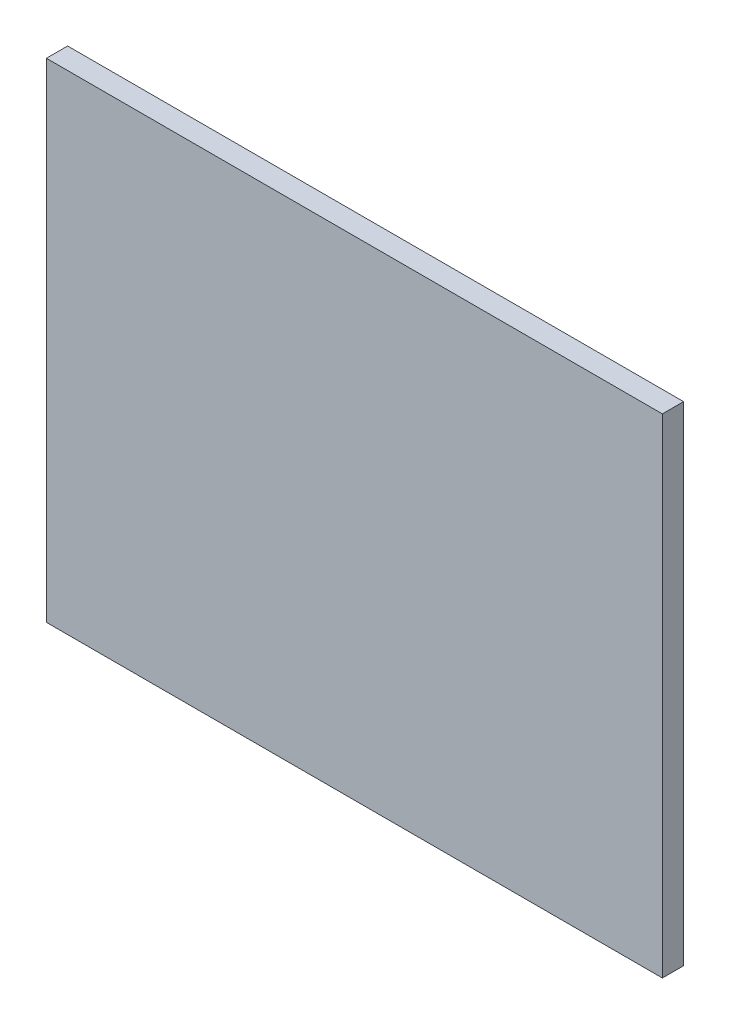
ISO-10303-21;
HEADER;
FILE_DESCRIPTION(('STEP AP214'),'2;1');
FILE_NAME('part.step','',(''),(''),'','','');
FILE_SCHEMA(('AUTOMOTIVE_DESIGN { 1 0 10303 214 1 1 1 1 }'));
ENDSEC;
DATA;
#1=APPLICATION_CONTEXT('core data for automotive mechanical design processes');
#2=APPLICATION_PROTOCOL_DEFINITION('international standard','automotive_design',2000,#1);
#3=PRODUCT_CONTEXT('',#1,'mechanical');
#4=PRODUCT('Part','Part','',(#3));
#5=PRODUCT_RELATED_PRODUCT_CATEGORY('part','',(#4));
#6=PRODUCT_DEFINITION_FORMATION('','',#4);
#7=PRODUCT_DEFINITION_CONTEXT('part definition',#1,'design');
#8=PRODUCT_DEFINITION('design','',#6,#7);
#9=PRODUCT_DEFINITION_SHAPE('','',#8);
#10=(LENGTH_UNIT() NAMED_UNIT(*) SI_UNIT(.MILLI.,.METRE.));
#11=(NAMED_UNIT(*) PLANE_ANGLE_UNIT() SI_UNIT($,.RADIAN.));
#12=(NAMED_UNIT(*) SI_UNIT($,.STERADIAN.) SOLID_ANGLE_UNIT());
#13=UNCERTAINTY_MEASURE_WITH_UNIT(LENGTH_MEASURE(1.E-05),#10,'distance_accuracy_value','');
#14=(GEOMETRIC_REPRESENTATION_CONTEXT(3) GLOBAL_UNCERTAINTY_ASSIGNED_CONTEXT((#13)) GLOBAL_UNIT_ASSIGNED_CONTEXT((#10,
#11,#12)) REPRESENTATION_CONTEXT('',''));
#15=CARTESIAN_POINT('',(0.,0.,0.));
#16=DIRECTION('',(0.,0.,1.));
#17=DIRECTION('',(1.,0.,0.));
#18=AXIS2_PLACEMENT_3D('',#15,#16,#17);
#19=CARTESIAN_POINT('',(0.,0.,10.));
#20=DIRECTION('',(1.,0.,0.));
#21=DIRECTION('',(0.,0.,-1.));
#22=AXIS2_PLACEMENT_3D('',#19,#20,#21);
#23=PLANE('',#22);
#24=DIRECTION('',(0.,-1.,0.));
#25=VECTOR('',#24,1.);
#26=CARTESIAN_POINT('',(0.,0.,0.));
#27=LINE('',#26,#25);
#28=CARTESIAN_POINT('',(0.,230.,0.));
#29=VERTEX_POINT('',#28);
#30=CARTESIAN_POINT('',(0.,0.,0.));
#31=VERTEX_POINT('',#30);
#32=EDGE_CURVE('E120',#29,#31,#27,.T.);
#33=ORIENTED_EDGE('',*,*,#32,.T.);
#34=DIRECTION('',(0.,0.,-1.));
#35=VECTOR('',#34,1.);
#36=CARTESIAN_POINT('',(0.,0.,10.));
#37=LINE('',#36,#35);
#38=CARTESIAN_POINT('',(0.,0.,10.));
#39=VERTEX_POINT('',#38);
#40=EDGE_CURVE('E11',#39,#31,#37,.T.);
#41=ORIENTED_EDGE('',*,*,#40,.F.);
#42=DIRECTION('',(0.,-1.,0.));
#43=VECTOR('',#42,1.);
#44=CARTESIAN_POINT('',(0.,0.,10.));
#45=LINE('',#44,#43);
#46=CARTESIAN_POINT('',(0.,230.,10.));
#47=VERTEX_POINT('',#46);
#48=EDGE_CURVE('E129',#47,#39,#45,.T.);
#49=ORIENTED_EDGE('',*,*,#48,.F.);
#50=DIRECTION('',(0.,0.,-1.));
#51=VECTOR('',#50,1.);
#52=CARTESIAN_POINT('',(0.,230.,10.));
#53=LINE('',#52,#51);
#54=EDGE_CURVE('E138',#47,#29,#53,.T.);
#55=ORIENTED_EDGE('',*,*,#54,.T.);
#56=EDGE_LOOP('',(#33,#41,#49,#55));
#57=FACE_BOUND('',#56,.T.);
#58=ADVANCED_FACE('F36',(#57),#23,.F.);
#59=CARTESIAN_POINT('',(0.,0.,10.));
#60=DIRECTION('',(0.,1.,0.));
#61=DIRECTION('',(0.,0.,1.));
#62=AXIS2_PLACEMENT_3D('',#59,#60,#61);
#63=PLANE('',#62);
#64=DIRECTION('',(1.,0.,0.));
#65=VECTOR('',#64,1.);
#66=CARTESIAN_POINT('',(0.,0.,0.));
#67=LINE('',#66,#65);
#68=CARTESIAN_POINT('',(290.,0.,0.));
#69=VERTEX_POINT('',#68);
#70=EDGE_CURVE('E123',#31,#69,#67,.T.);
#71=ORIENTED_EDGE('',*,*,#70,.T.);
#72=DIRECTION('',(0.,0.,-1.));
#73=VECTOR('',#72,1.);
#74=CARTESIAN_POINT('',(290.,0.,10.));
#75=LINE('',#74,#73);
#76=CARTESIAN_POINT('',(290.,0.,10.));
#77=VERTEX_POINT('',#76);
#78=EDGE_CURVE('E43',#77,#69,#75,.T.);
#79=ORIENTED_EDGE('',*,*,#78,.F.);
#80=DIRECTION('',(1.,0.,0.));
#81=VECTOR('',#80,1.);
#82=CARTESIAN_POINT('',(0.,0.,10.));
#83=LINE('',#82,#81);
#84=EDGE_CURVE('E132',#39,#77,#83,.T.);
#85=ORIENTED_EDGE('',*,*,#84,.F.);
#86=ORIENTED_EDGE('',*,*,#40,.T.);
#87=EDGE_LOOP('',(#71,#79,#85,#86));
#88=FACE_BOUND('',#87,.T.);
#89=ADVANCED_FACE('F169',(#88),#63,.F.);
#90=CARTESIAN_POINT('',(290.,0.,10.));
#91=DIRECTION('',(-1.,0.,0.));
#92=DIRECTION('',(0.,0.,1.));
#93=AXIS2_PLACEMENT_3D('',#90,#91,#92);
#94=PLANE('',#93);
#95=DIRECTION('',(0.,1.,0.));
#96=VECTOR('',#95,1.);
#97=CARTESIAN_POINT('',(290.,0.,0.));
#98=LINE('',#97,#96);
#99=CARTESIAN_POINT('',(290.,230.,0.));
#100=VERTEX_POINT('',#99);
#101=EDGE_CURVE('E141',#69,#100,#98,.T.);
#102=ORIENTED_EDGE('',*,*,#101,.T.);
#103=DIRECTION('',(0.,0.,-1.));
#104=VECTOR('',#103,1.);
#105=CARTESIAN_POINT('',(290.,230.,10.));
#106=LINE('',#105,#104);
#107=CARTESIAN_POINT('',(290.,230.,10.));
#108=VERTEX_POINT('',#107);
#109=EDGE_CURVE('E146',#108,#100,#106,.T.);
#110=ORIENTED_EDGE('',*,*,#109,.F.);
#111=DIRECTION('',(0.,1.,0.));
#112=VECTOR('',#111,1.);
#113=CARTESIAN_POINT('',(290.,0.,10.));
#114=LINE('',#113,#112);
#115=EDGE_CURVE('E135',#77,#108,#114,.T.);
#116=ORIENTED_EDGE('',*,*,#115,.F.);
#117=ORIENTED_EDGE('',*,*,#78,.T.);
#118=EDGE_LOOP('',(#102,#110,#116,#117));
#119=FACE_BOUND('',#118,.T.);
#120=ADVANCED_FACE('F153',(#119),#94,.F.);
#121=CARTESIAN_POINT('',(0.,230.,10.));
#122=DIRECTION('',(0.,-1.,0.));
#123=DIRECTION('',(0.,0.,-1.));
#124=AXIS2_PLACEMENT_3D('',#121,#122,#123);
#125=PLANE('',#124);
#126=DIRECTION('',(-1.,0.,0.));
#127=VECTOR('',#126,1.);
#128=CARTESIAN_POINT('',(0.,230.,0.));
#129=LINE('',#128,#127);
#130=EDGE_CURVE('E133',#100,#29,#129,.T.);
#131=ORIENTED_EDGE('',*,*,#130,.T.);
#132=ORIENTED_EDGE('',*,*,#54,.F.);
#133=DIRECTION('',(-1.,0.,0.));
#134=VECTOR('',#133,1.);
#135=CARTESIAN_POINT('',(0.,230.,10.));
#136=LINE('',#135,#134);
#137=EDGE_CURVE('E137',#108,#47,#136,.T.);
#138=ORIENTED_EDGE('',*,*,#137,.F.);
#139=ORIENTED_EDGE('',*,*,#109,.T.);
#140=EDGE_LOOP('',(#131,#132,#138,#139));
#141=FACE_BOUND('',#140,.T.);
#142=ADVANCED_FACE('F162',(#141),#125,.F.);
#143=CARTESIAN_POINT('',(0.,0.,10.));
#144=DIRECTION('',(0.,0.,-1.));
#145=DIRECTION('',(-1.,0.,0.));
#146=AXIS2_PLACEMENT_3D('',#143,#144,#145);
#147=PLANE('',#146);
#148=ORIENTED_EDGE('',*,*,#48,.T.);
#149=ORIENTED_EDGE('',*,*,#84,.T.);
#150=ORIENTED_EDGE('',*,*,#115,.T.);
#151=ORIENTED_EDGE('',*,*,#137,.T.);
#152=EDGE_LOOP('',(#148,#149,#150,#151));
#153=FACE_BOUND('',#152,.T.);
#154=ADVANCED_FACE('F168',(#153),#147,.F.);
#155=CARTESIAN_POINT('',(0.,0.,0.));
#156=DIRECTION('',(0.,0.,-1.));
#157=DIRECTION('',(-1.,0.,0.));
#158=AXIS2_PLACEMENT_3D('',#155,#156,#157);
#159=PLANE('',#158);
#160=DIRECTION('',(0.,-1.,0.));
#161=VECTOR('',#160,1.);
#162=CARTESIAN_POINT('',(275.,0.,0.));
#163=LINE('',#162,#161);
#164=CARTESIAN_POINT('',(275.,215.,0.));
#165=VERTEX_POINT('',#164);
#166=CARTESIAN_POINT('',(275.,15.,0.));
#167=VERTEX_POINT('',#166);
#168=EDGE_CURVE('E50',#165,#167,#163,.T.);
#169=ORIENTED_EDGE('',*,*,#168,.F.);
#170=DIRECTION('',(1.,0.,0.));
#171=VECTOR('',#170,1.);
#172=CARTESIAN_POINT('',(0.,215.,0.));
#173=LINE('',#172,#171);
#174=CARTESIAN_POINT('',(15.,215.,0.));
#175=VERTEX_POINT('',#174);
#176=EDGE_CURVE('E54',#175,#165,#173,.T.);
#177=ORIENTED_EDGE('',*,*,#176,.F.);
#178=DIRECTION('',(0.,1.,0.));
#179=VECTOR('',#178,1.);
#180=CARTESIAN_POINT('',(15.,0.,0.));
#181=LINE('',#180,#179);
#182=CARTESIAN_POINT('',(15.,15.,0.));
#183=VERTEX_POINT('',#182);
#184=EDGE_CURVE('E263',#183,#175,#181,.T.);
#185=ORIENTED_EDGE('',*,*,#184,.F.);
#186=DIRECTION('',(-1.,0.,0.));
#187=VECTOR('',#186,1.);
#188=CARTESIAN_POINT('',(0.,15.,0.));
#189=LINE('',#188,#187);
#190=EDGE_CURVE('E269',#167,#183,#189,.T.);
#191=ORIENTED_EDGE('',*,*,#190,.F.);
#192=EDGE_LOOP('',(#169,#177,#185,#191));
#193=FACE_BOUND('',#192,.T.);
#194=ORIENTED_EDGE('',*,*,#32,.F.);
#195=ORIENTED_EDGE('',*,*,#130,.F.);
#196=ORIENTED_EDGE('',*,*,#101,.F.);
#197=ORIENTED_EDGE('',*,*,#70,.F.);
#198=EDGE_LOOP('',(#194,#195,#196,#197));
#199=FACE_BOUND('',#198,.T.);
#200=ADVANCED_FACE('F159',(#193,#199),#159,.T.);
#201=CARTESIAN_POINT('',(275.,0.,-10.));
#202=DIRECTION('',(-1.,0.,0.));
#203=DIRECTION('',(0.,0.,1.));
#204=AXIS2_PLACEMENT_3D('',#201,#202,#203);
#205=PLANE('',#204);
#206=ORIENTED_EDGE('',*,*,#168,.T.);
#207=DIRECTION('',(0.,0.,1.));
#208=VECTOR('',#207,1.);
#209=CARTESIAN_POINT('',(275.,15.,-10.));
#210=LINE('',#209,#208);
#211=CARTESIAN_POINT('',(275.,15.,-10.));
#212=VERTEX_POINT('',#211);
#213=EDGE_CURVE('E103',#212,#167,#210,.T.);
#214=ORIENTED_EDGE('',*,*,#213,.F.);
#215=DIRECTION('',(0.,-1.,0.));
#216=VECTOR('',#215,1.);
#217=CARTESIAN_POINT('',(275.,0.,-10.));
#218=LINE('',#217,#216);
#219=CARTESIAN_POINT('',(275.,215.,-10.));
#220=VERTEX_POINT('',#219);
#221=EDGE_CURVE('E109',#220,#212,#218,.T.);
#222=ORIENTED_EDGE('',*,*,#221,.F.);
#223=DIRECTION('',(0.,0.,1.));
#224=VECTOR('',#223,1.);
#225=CARTESIAN_POINT('',(275.,215.,-10.));
#226=LINE('',#225,#224);
#227=EDGE_CURVE('E261',#220,#165,#226,.T.);
#228=ORIENTED_EDGE('',*,*,#227,.T.);
#229=EDGE_LOOP('',(#206,#214,#222,#228));
#230=FACE_BOUND('',#229,.T.);
#231=ADVANCED_FACE('F119',(#230),#205,.F.);
#232=CARTESIAN_POINT('',(0.,15.,-10.));
#233=DIRECTION('',(0.,1.,0.));
#234=DIRECTION('',(-1.,0.,0.));
#235=AXIS2_PLACEMENT_3D('',#232,#233,#234);
#236=PLANE('',#235);
#237=ORIENTED_EDGE('',*,*,#190,.T.);
#238=DIRECTION('',(0.,0.,1.));
#239=VECTOR('',#238,1.);
#240=CARTESIAN_POINT('',(15.,15.,-10.));
#241=LINE('',#240,#239);
#242=CARTESIAN_POINT('',(15.,15.,-10.));
#243=VERTEX_POINT('',#242);
#244=EDGE_CURVE('E105',#243,#183,#241,.T.);
#245=ORIENTED_EDGE('',*,*,#244,.F.);
#246=DIRECTION('',(-1.,0.,0.));
#247=VECTOR('',#246,1.);
#248=CARTESIAN_POINT('',(0.,15.,-10.));
#249=LINE('',#248,#247);
#250=EDGE_CURVE('E98',#212,#243,#249,.T.);
#251=ORIENTED_EDGE('',*,*,#250,.F.);
#252=ORIENTED_EDGE('',*,*,#213,.T.);
#253=EDGE_LOOP('',(#237,#245,#251,#252));
#254=FACE_BOUND('',#253,.T.);
#255=ADVANCED_FACE('F101',(#254),#236,.F.);
#256=CARTESIAN_POINT('',(15.,0.,-10.));
#257=DIRECTION('',(1.,0.,0.));
#258=DIRECTION('',(0.,0.,-1.));
#259=AXIS2_PLACEMENT_3D('',#256,#257,#258);
#260=PLANE('',#259);
#261=ORIENTED_EDGE('',*,*,#184,.T.);
#262=DIRECTION('',(0.,0.,1.));
#263=VECTOR('',#262,1.);
#264=CARTESIAN_POINT('',(15.,215.,-10.));
#265=LINE('',#264,#263);
#266=CARTESIAN_POINT('',(15.,215.,-10.));
#267=VERTEX_POINT('',#266);
#268=EDGE_CURVE('E125',#267,#175,#265,.T.);
#269=ORIENTED_EDGE('',*,*,#268,.F.);
#270=DIRECTION('',(0.,1.,0.));
#271=VECTOR('',#270,1.);
#272=CARTESIAN_POINT('',(15.,0.,-10.));
#273=LINE('',#272,#271);
#274=EDGE_CURVE('E108',#243,#267,#273,.T.);
#275=ORIENTED_EDGE('',*,*,#274,.F.);
#276=ORIENTED_EDGE('',*,*,#244,.T.);
#277=EDGE_LOOP('',(#261,#269,#275,#276));
#278=FACE_BOUND('',#277,.T.);
#279=ADVANCED_FACE('F187',(#278),#260,.F.);
#280=CARTESIAN_POINT('',(0.,215.,-10.));
#281=DIRECTION('',(0.,-1.,0.));
#282=DIRECTION('',(1.,0.,0.));
#283=AXIS2_PLACEMENT_3D('',#280,#281,#282);
#284=PLANE('',#283);
#285=ORIENTED_EDGE('',*,*,#176,.T.);
#286=ORIENTED_EDGE('',*,*,#227,.F.);
#287=DIRECTION('',(1.,0.,0.));
#288=VECTOR('',#287,1.);
#289=CARTESIAN_POINT('',(0.,215.,-10.));
#290=LINE('',#289,#288);
#291=EDGE_CURVE('E114',#267,#220,#290,.T.);
#292=ORIENTED_EDGE('',*,*,#291,.F.);
#293=ORIENTED_EDGE('',*,*,#268,.T.);
#294=EDGE_LOOP('',(#285,#286,#292,#293));
#295=FACE_BOUND('',#294,.T.);
#296=ADVANCED_FACE('F190',(#295),#284,.F.);
#297=CARTESIAN_POINT('',(0.,0.,-10.));
#298=DIRECTION('',(0.,0.,-1.));
#299=DIRECTION('',(-1.,0.,0.));
#300=AXIS2_PLACEMENT_3D('',#297,#298,#299);
#301=PLANE('',#300);
#302=ORIENTED_EDGE('',*,*,#221,.T.);
#303=ORIENTED_EDGE('',*,*,#250,.T.);
#304=ORIENTED_EDGE('',*,*,#274,.T.);
#305=ORIENTED_EDGE('',*,*,#291,.T.);
#306=EDGE_LOOP('',(#302,#303,#304,#305));
#307=FACE_BOUND('',#306,.T.);
#308=ADVANCED_FACE('F112',(#307),#301,.T.);
#309=CLOSED_SHELL('',(#58,#89,#120,#142,#154,#200,#231,#255,#279,#296,#308));
#310=MANIFOLD_SOLID_BREP('B2',#309);
#311=ADVANCED_BREP_SHAPE_REPRESENTATION('',(#18,#310),#14);
#312=SHAPE_DEFINITION_REPRESENTATION(#9,#311);
ENDSEC;
END-ISO-10303-21;
